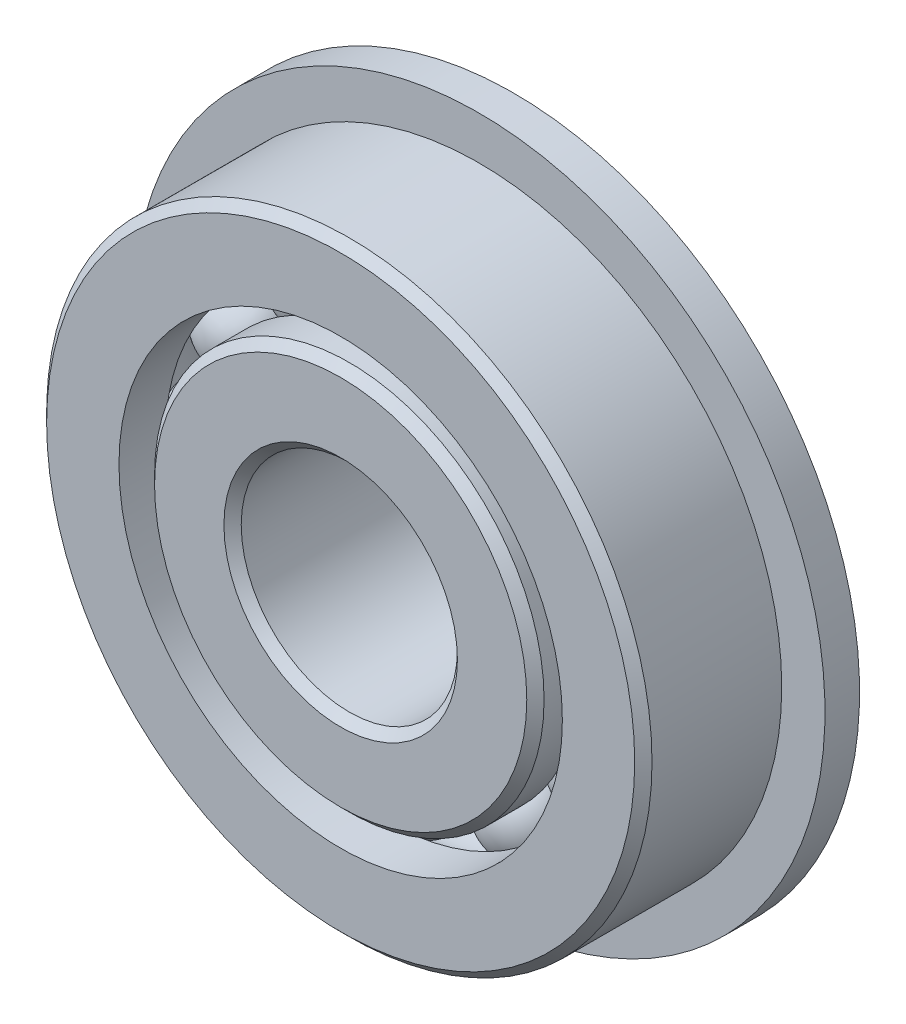
ISO-10303-21;
HEADER;
FILE_DESCRIPTION(('STEP AP214'),'2;1');
FILE_NAME('part.step','',(''),(''),'','','');
FILE_SCHEMA(('AUTOMOTIVE_DESIGN { 1 0 10303 214 1 1 1 1 }'));
ENDSEC;
DATA;
#1=APPLICATION_CONTEXT('core data for automotive mechanical design processes');
#2=APPLICATION_PROTOCOL_DEFINITION('international standard','automotive_design',2000,#1);
#3=PRODUCT_CONTEXT('',#1,'mechanical');
#4=PRODUCT('Part','Part','',(#3));
#5=PRODUCT_RELATED_PRODUCT_CATEGORY('part','',(#4));
#6=PRODUCT_DEFINITION_FORMATION('','',#4);
#7=PRODUCT_DEFINITION_CONTEXT('part definition',#1,'design');
#8=PRODUCT_DEFINITION('design','',#6,#7);
#9=PRODUCT_DEFINITION_SHAPE('','',#8);
#10=(LENGTH_UNIT() NAMED_UNIT(*) SI_UNIT(.MILLI.,.METRE.));
#11=(NAMED_UNIT(*) PLANE_ANGLE_UNIT() SI_UNIT($,.RADIAN.));
#12=(NAMED_UNIT(*) SI_UNIT($,.STERADIAN.) SOLID_ANGLE_UNIT());
#13=UNCERTAINTY_MEASURE_WITH_UNIT(LENGTH_MEASURE(1.E-05),#10,'distance_accuracy_value','');
#14=(GEOMETRIC_REPRESENTATION_CONTEXT(3) GLOBAL_UNCERTAINTY_ASSIGNED_CONTEXT((#13)) GLOBAL_UNIT_ASSIGNED_CONTEXT((#10,
#11,#12)) REPRESENTATION_CONTEXT('',''));
#15=CARTESIAN_POINT('',(0.,0.,0.));
#16=DIRECTION('',(0.,0.,1.));
#17=DIRECTION('',(1.,0.,0.));
#18=AXIS2_PLACEMENT_3D('',#15,#16,#17);
#19=CARTESIAN_POINT('',(-3.77031249999992,6.53037281041208,0.));
#20=DIRECTION('',(0.,0.,1.));
#21=DIRECTION('',(-0.499999999999989,0.866025403784445,0.));
#22=AXIS2_PLACEMENT_3D('',#19,#20,#21);
#23=SPHERICAL_SURFACE('',#22,1.5875);
#24=CARTESIAN_POINT('',(-3.77031249999992,6.53037281041208,1.5875));
#25=VERTEX_POINT('',#24);
#26=VERTEX_LOOP('',#25);
#27=FACE_BOUND('',#26,.T.);
#28=ADVANCED_FACE('F37',(#27),#23,.T.);
#29=CLOSED_SHELL('',(#28));
#30=MANIFOLD_SOLID_BREP('B2',#29);
#31=CARTESIAN_POINT('',(-6.53037281041199,3.77031250000008,0.));
#32=DIRECTION('',(0.,0.,1.));
#33=DIRECTION('',(-0.866025403784433,0.50000000000001,0.));
#34=AXIS2_PLACEMENT_3D('',#31,#32,#33);
#35=SPHERICAL_SURFACE('',#34,1.5875);
#36=CARTESIAN_POINT('',(-6.53037281041199,3.77031250000008,1.5875));
#37=VERTEX_POINT('',#36);
#38=VERTEX_LOOP('',#37);
#39=FACE_BOUND('',#38,.T.);
#40=ADVANCED_FACE('F57',(#39),#35,.T.);
#41=CLOSED_SHELL('',(#40));
#42=MANIFOLD_SOLID_BREP('B6',#41);
#43=CARTESIAN_POINT('',(-7.540625,0.,0.));
#44=DIRECTION('',(0.,0.,1.));
#45=DIRECTION('',(-1.,0.,0.));
#46=AXIS2_PLACEMENT_3D('',#43,#44,#45);
#47=SPHERICAL_SURFACE('',#46,1.5875);
#48=CARTESIAN_POINT('',(-7.540625,0.,1.5875));
#49=VERTEX_POINT('',#48);
#50=VERTEX_LOOP('',#49);
#51=FACE_BOUND('',#50,.T.);
#52=ADVANCED_FACE('F77',(#51),#47,.T.);
#53=CLOSED_SHELL('',(#52));
#54=MANIFOLD_SOLID_BREP('B33',#53);
#55=CARTESIAN_POINT('',(-6.53037281041207,-3.77031249999994,0.));
#56=DIRECTION('',(0.,0.,1.));
#57=DIRECTION('',(-0.866025403784443,-0.499999999999992,0.));
#58=AXIS2_PLACEMENT_3D('',#55,#56,#57);
#59=SPHERICAL_SURFACE('',#58,1.5875);
#60=CARTESIAN_POINT('',(-6.53037281041207,-3.77031249999994,1.5875));
#61=VERTEX_POINT('',#60);
#62=VERTEX_LOOP('',#61);
#63=FACE_BOUND('',#62,.T.);
#64=ADVANCED_FACE('F97',(#63),#59,.T.);
#65=CLOSED_SHELL('',(#64));
#66=MANIFOLD_SOLID_BREP('B53',#65);
#67=CARTESIAN_POINT('',(-3.77031250000005,-6.530372810412,0.));
#68=DIRECTION('',(0.,0.,1.));
#69=DIRECTION('',(-0.500000000000007,-0.866025403784435,0.));
#70=AXIS2_PLACEMENT_3D('',#67,#68,#69);
#71=SPHERICAL_SURFACE('',#70,1.5875);
#72=CARTESIAN_POINT('',(-3.77031250000005,-6.530372810412,1.5875));
#73=VERTEX_POINT('',#72);
#74=VERTEX_LOOP('',#73);
#75=FACE_BOUND('',#74,.T.);
#76=ADVANCED_FACE('F117',(#75),#71,.T.);
#77=CLOSED_SHELL('',(#76));
#78=MANIFOLD_SOLID_BREP('B73',#77);
#79=CARTESIAN_POINT('',(0.,-7.540625,0.));
#80=DIRECTION('',(0.,0.,1.));
#81=DIRECTION('',(0.,-1.,0.));
#82=AXIS2_PLACEMENT_3D('',#79,#80,#81);
#83=SPHERICAL_SURFACE('',#82,1.5875);
#84=CARTESIAN_POINT('',(0.,-7.540625,1.5875));
#85=VERTEX_POINT('',#84);
#86=VERTEX_LOOP('',#85);
#87=FACE_BOUND('',#86,.T.);
#88=ADVANCED_FACE('F137',(#87),#83,.T.);
#89=CLOSED_SHELL('',(#88));
#90=MANIFOLD_SOLID_BREP('B93',#89);
#91=CARTESIAN_POINT('',(3.77031249999996,-6.53037281041205,0.));
#92=DIRECTION('',(0.,0.,1.));
#93=DIRECTION('',(0.499999999999995,-0.866025403784442,0.));
#94=AXIS2_PLACEMENT_3D('',#91,#92,#93);
#95=SPHERICAL_SURFACE('',#94,1.5875);
#96=CARTESIAN_POINT('',(3.77031249999996,-6.53037281041205,1.5875));
#97=VERTEX_POINT('',#96);
#98=VERTEX_LOOP('',#97);
#99=FACE_BOUND('',#98,.T.);
#100=ADVANCED_FACE('F157',(#99),#95,.T.);
#101=CLOSED_SHELL('',(#100));
#102=MANIFOLD_SOLID_BREP('B113',#101);
#103=CARTESIAN_POINT('',(6.53037281041202,-3.77031250000003,0.));
#104=DIRECTION('',(0.,0.,1.));
#105=DIRECTION('',(0.866025403784436,-0.500000000000004,0.));
#106=AXIS2_PLACEMENT_3D('',#103,#104,#105);
#107=SPHERICAL_SURFACE('',#106,1.5875);
#108=CARTESIAN_POINT('',(6.53037281041202,-3.77031250000003,1.5875));
#109=VERTEX_POINT('',#108);
#110=VERTEX_LOOP('',#109);
#111=FACE_BOUND('',#110,.T.);
#112=ADVANCED_FACE('F177',(#111),#107,.T.);
#113=CLOSED_SHELL('',(#112));
#114=MANIFOLD_SOLID_BREP('B133',#113);
#115=CARTESIAN_POINT('',(7.540625,0.,0.));
#116=DIRECTION('',(0.,0.,1.));
#117=DIRECTION('',(1.,0.,0.));
#118=AXIS2_PLACEMENT_3D('',#115,#116,#117);
#119=SPHERICAL_SURFACE('',#118,1.5875);
#120=CARTESIAN_POINT('',(7.540625,0.,1.5875));
#121=VERTEX_POINT('',#120);
#122=VERTEX_LOOP('',#121);
#123=FACE_BOUND('',#122,.T.);
#124=ADVANCED_FACE('F197',(#123),#119,.T.);
#125=CLOSED_SHELL('',(#124));
#126=MANIFOLD_SOLID_BREP('B153',#125);
#127=CARTESIAN_POINT('',(6.53037281041204,3.77031249999998,0.));
#128=DIRECTION('',(0.,0.,1.));
#129=DIRECTION('',(0.86602540378444,0.499999999999998,0.));
#130=AXIS2_PLACEMENT_3D('',#127,#128,#129);
#131=SPHERICAL_SURFACE('',#130,1.5875);
#132=CARTESIAN_POINT('',(6.53037281041204,3.77031249999998,1.5875));
#133=VERTEX_POINT('',#132);
#134=VERTEX_LOOP('',#133);
#135=FACE_BOUND('',#134,.T.);
#136=ADVANCED_FACE('F217',(#135),#131,.T.);
#137=CLOSED_SHELL('',(#136));
#138=MANIFOLD_SOLID_BREP('B173',#137);
#139=CARTESIAN_POINT('',(3.77031250000001,6.53037281041203,0.));
#140=DIRECTION('',(0.,0.,1.));
#141=DIRECTION('',(0.500000000000001,0.866025403784438,0.));
#142=AXIS2_PLACEMENT_3D('',#139,#140,#141);
#143=SPHERICAL_SURFACE('',#142,1.5875);
#144=CARTESIAN_POINT('',(3.77031250000001,6.53037281041203,1.5875));
#145=VERTEX_POINT('',#144);
#146=VERTEX_LOOP('',#145);
#147=FACE_BOUND('',#146,.T.);
#148=ADVANCED_FACE('F237',(#147),#143,.T.);
#149=CLOSED_SHELL('',(#148));
#150=MANIFOLD_SOLID_BREP('B193',#149);
#151=CARTESIAN_POINT('',(0.,7.540625,0.));
#152=DIRECTION('',(0.,0.,1.));
#153=DIRECTION('',(0.,1.,0.));
#154=AXIS2_PLACEMENT_3D('',#151,#152,#153);
#155=SPHERICAL_SURFACE('',#154,1.5875);
#156=CARTESIAN_POINT('',(0.,7.540625,1.5875));
#157=VERTEX_POINT('',#156);
#158=VERTEX_LOOP('',#157);
#159=FACE_BOUND('',#158,.T.);
#160=ADVANCED_FACE('F259',(#159),#155,.T.);
#161=CLOSED_SHELL('',(#160));
#162=MANIFOLD_SOLID_BREP('B213',#161);
#163=CARTESIAN_POINT('',(0.,0.,2.8575));
#164=DIRECTION('',(0.,0.,-1.));
#165=DIRECTION('',(-1.,0.,0.));
#166=AXIS2_PLACEMENT_3D('',#163,#164,#165);
#167=CONICAL_SURFACE('',#166,7.1501,0.785398163397444);
#168=CARTESIAN_POINT('',(0.,0.,3.175));
#169=DIRECTION('',(0.,0.,1.));
#170=DIRECTION('',(1.,0.,0.));
#171=AXIS2_PLACEMENT_3D('',#168,#169,#170);
#172=CIRCLE('',#171,6.8326);
#173=CARTESIAN_POINT('',(6.8326,0.,3.175));
#174=VERTEX_POINT('',#173);
#175=EDGE_CURVE('E258',#174,#174,#172,.T.);
#176=ORIENTED_EDGE('',*,*,#175,.F.);
#177=EDGE_LOOP('',(#176));
#178=FACE_BOUND('',#177,.T.);
#179=CARTESIAN_POINT('',(0.,0.,2.8575));
#180=DIRECTION('',(0.,0.,1.));
#181=DIRECTION('',(1.,0.,0.));
#182=AXIS2_PLACEMENT_3D('',#179,#180,#181);
#183=CIRCLE('',#182,7.1501);
#184=CARTESIAN_POINT('',(7.1501,0.,2.8575));
#185=VERTEX_POINT('',#184);
#186=EDGE_CURVE('E312',#185,#185,#183,.T.);
#187=ORIENTED_EDGE('',*,*,#186,.T.);
#188=EDGE_LOOP('',(#187));
#189=FACE_BOUND('',#188,.T.);
#190=ADVANCED_FACE('F278',(#178,#189),#167,.T.);
#191=CARTESIAN_POINT('',(0.,4.28625,3.175));
#192=DIRECTION('',(0.,0.,-1.));
#193=DIRECTION('',(-1.,0.,0.));
#194=AXIS2_PLACEMENT_3D('',#191,#192,#193);
#195=PLANE('',#194);
#196=CARTESIAN_POINT('',(0.,0.,3.175));
#197=DIRECTION('',(0.,0.,1.));
#198=DIRECTION('',(1.,0.,0.));
#199=AXIS2_PLACEMENT_3D('',#196,#197,#198);
#200=CIRCLE('',#199,4.28625);
#201=CARTESIAN_POINT('',(4.28625,0.,3.175));
#202=VERTEX_POINT('',#201);
#203=EDGE_CURVE('E284',#202,#202,#200,.T.);
#204=ORIENTED_EDGE('',*,*,#203,.F.);
#205=EDGE_LOOP('',(#204));
#206=FACE_BOUND('',#205,.T.);
#207=ORIENTED_EDGE('',*,*,#175,.T.);
#208=EDGE_LOOP('',(#207));
#209=FACE_BOUND('',#208,.T.);
#210=ADVANCED_FACE('F361',(#206,#209),#195,.F.);
#211=CARTESIAN_POINT('',(0.,0.,3.175));
#212=DIRECTION('',(0.,0.,1.));
#213=DIRECTION('',(1.,0.,0.));
#214=AXIS2_PLACEMENT_3D('',#211,#212,#213);
#215=CONICAL_SURFACE('',#214,4.28625,0.785398163397448);
#216=CARTESIAN_POINT('',(0.,0.,2.8575));
#217=DIRECTION('',(0.,0.,1.));
#218=DIRECTION('',(1.,0.,0.));
#219=AXIS2_PLACEMENT_3D('',#216,#217,#218);
#220=CIRCLE('',#219,3.96875);
#221=CARTESIAN_POINT('',(3.96875,0.,2.8575));
#222=VERTEX_POINT('',#221);
#223=EDGE_CURVE('E288',#222,#222,#220,.T.);
#224=ORIENTED_EDGE('',*,*,#223,.F.);
#225=EDGE_LOOP('',(#224));
#226=FACE_BOUND('',#225,.T.);
#227=ORIENTED_EDGE('',*,*,#203,.T.);
#228=EDGE_LOOP('',(#227));
#229=FACE_BOUND('',#228,.T.);
#230=ADVANCED_FACE('F356',(#226,#229),#215,.F.);
#231=CARTESIAN_POINT('',(0.,0.,3.175));
#232=DIRECTION('',(0.,0.,1.));
#233=DIRECTION('',(1.,0.,0.));
#234=AXIS2_PLACEMENT_3D('',#231,#232,#233);
#235=CYLINDRICAL_SURFACE('',#234,3.96875);
#236=CARTESIAN_POINT('',(0.,0.,-4.4577));
#237=DIRECTION('',(0.,0.,1.));
#238=DIRECTION('',(1.,0.,0.));
#239=AXIS2_PLACEMENT_3D('',#236,#237,#238);
#240=CIRCLE('',#239,3.96875);
#241=CARTESIAN_POINT('',(3.96875,0.,-4.4577));
#242=VERTEX_POINT('',#241);
#243=EDGE_CURVE('E292',#242,#242,#240,.T.);
#244=ORIENTED_EDGE('',*,*,#243,.F.);
#245=EDGE_LOOP('',(#244));
#246=FACE_BOUND('',#245,.T.);
#247=ORIENTED_EDGE('',*,*,#223,.T.);
#248=EDGE_LOOP('',(#247));
#249=FACE_BOUND('',#248,.T.);
#250=ADVANCED_FACE('F350',(#246,#249),#235,.F.);
#251=CARTESIAN_POINT('',(0.,0.,-4.4577));
#252=DIRECTION('',(0.,0.,-1.));
#253=DIRECTION('',(-1.,0.,0.));
#254=AXIS2_PLACEMENT_3D('',#251,#252,#253);
#255=CONICAL_SURFACE('',#254,3.96875,0.785398163397446);
#256=CARTESIAN_POINT('',(0.,0.,-4.7752));
#257=DIRECTION('',(0.,0.,1.));
#258=DIRECTION('',(1.,0.,0.));
#259=AXIS2_PLACEMENT_3D('',#256,#257,#258);
#260=CIRCLE('',#259,4.28625);
#261=CARTESIAN_POINT('',(4.28625,0.,-4.7752));
#262=VERTEX_POINT('',#261);
#263=EDGE_CURVE('E297',#262,#262,#260,.T.);
#264=ORIENTED_EDGE('',*,*,#263,.F.);
#265=EDGE_LOOP('',(#264));
#266=FACE_BOUND('',#265,.T.);
#267=ORIENTED_EDGE('',*,*,#243,.T.);
#268=EDGE_LOOP('',(#267));
#269=FACE_BOUND('',#268,.T.);
#270=ADVANCED_FACE('F344',(#266,#269),#255,.F.);
#271=CARTESIAN_POINT('',(0.,6.8326,-4.7752));
#272=DIRECTION('',(0.,0.,1.));
#273=DIRECTION('',(1.,0.,0.));
#274=AXIS2_PLACEMENT_3D('',#271,#272,#273);
#275=PLANE('',#274);
#276=CARTESIAN_POINT('',(0.,0.,-4.7752));
#277=DIRECTION('',(0.,0.,1.));
#278=DIRECTION('',(1.,0.,0.));
#279=AXIS2_PLACEMENT_3D('',#276,#277,#278);
#280=CIRCLE('',#279,6.8326);
#281=CARTESIAN_POINT('',(6.8326,0.,-4.7752));
#282=VERTEX_POINT('',#281);
#283=EDGE_CURVE('E300',#282,#282,#280,.T.);
#284=ORIENTED_EDGE('',*,*,#283,.F.);
#285=EDGE_LOOP('',(#284));
#286=FACE_BOUND('',#285,.T.);
#287=ORIENTED_EDGE('',*,*,#263,.T.);
#288=EDGE_LOOP('',(#287));
#289=FACE_BOUND('',#288,.T.);
#290=ADVANCED_FACE('F338',(#286,#289),#275,.F.);
#291=CARTESIAN_POINT('',(0.,0.,-4.7752));
#292=DIRECTION('',(0.,0.,1.));
#293=DIRECTION('',(1.,0.,0.));
#294=AXIS2_PLACEMENT_3D('',#291,#292,#293);
#295=CONICAL_SURFACE('',#294,6.8326,0.785398163397448);
#296=CARTESIAN_POINT('',(0.,0.,-4.4577));
#297=DIRECTION('',(0.,0.,1.));
#298=DIRECTION('',(1.,0.,0.));
#299=AXIS2_PLACEMENT_3D('',#296,#297,#298);
#300=CIRCLE('',#299,7.1501);
#301=CARTESIAN_POINT('',(7.1501,0.,-4.4577));
#302=VERTEX_POINT('',#301);
#303=EDGE_CURVE('E303',#302,#302,#300,.T.);
#304=ORIENTED_EDGE('',*,*,#303,.F.);
#305=EDGE_LOOP('',(#304));
#306=FACE_BOUND('',#305,.T.);
#307=ORIENTED_EDGE('',*,*,#283,.T.);
#308=EDGE_LOOP('',(#307));
#309=FACE_BOUND('',#308,.T.);
#310=ADVANCED_FACE('F332',(#306,#309),#295,.T.);
#311=CARTESIAN_POINT('',(0.,0.,3.175));
#312=DIRECTION('',(0.,0.,1.));
#313=DIRECTION('',(1.,0.,0.));
#314=AXIS2_PLACEMENT_3D('',#311,#312,#313);
#315=CYLINDRICAL_SURFACE('',#314,7.1501);
#316=CARTESIAN_POINT('',(0.,0.,-1.53871585238309));
#317=DIRECTION('',(0.,0.,1.));
#318=DIRECTION('',(1.,0.,0.));
#319=AXIS2_PLACEMENT_3D('',#316,#317,#318);
#320=CIRCLE('',#319,7.1501);
#321=CARTESIAN_POINT('',(7.1501,0.,-1.53871585238309));
#322=VERTEX_POINT('',#321);
#323=EDGE_CURVE('E306',#322,#322,#320,.T.);
#324=ORIENTED_EDGE('',*,*,#323,.F.);
#325=EDGE_LOOP('',(#324));
#326=FACE_BOUND('',#325,.T.);
#327=ORIENTED_EDGE('',*,*,#303,.T.);
#328=EDGE_LOOP('',(#327));
#329=FACE_BOUND('',#328,.T.);
#330=ADVANCED_FACE('F326',(#326,#329),#315,.T.);
#331=CARTESIAN_POINT('',(0.,0.,0.));
#332=DIRECTION('',(0.,0.,1.));
#333=DIRECTION('',(1.,0.,0.));
#334=AXIS2_PLACEMENT_3D('',#331,#332,#333);
#335=TOROIDAL_SURFACE('',#334,7.540625,1.5875);
#336=CARTESIAN_POINT('',(0.,0.,1.53871585238309));
#337=DIRECTION('',(0.,0.,1.));
#338=DIRECTION('',(1.,0.,0.));
#339=AXIS2_PLACEMENT_3D('',#336,#337,#338);
#340=CIRCLE('',#339,7.1501);
#341=CARTESIAN_POINT('',(7.1501,0.,1.53871585238309));
#342=VERTEX_POINT('',#341);
#343=EDGE_CURVE('E309',#342,#342,#340,.T.);
#344=ORIENTED_EDGE('',*,*,#343,.F.);
#345=EDGE_LOOP('',(#344));
#346=FACE_BOUND('',#345,.T.);
#347=ORIENTED_EDGE('',*,*,#323,.T.);
#348=EDGE_LOOP('',(#347));
#349=FACE_BOUND('',#348,.T.);
#350=ADVANCED_FACE('F320',(#346,#349),#335,.F.);
#351=CARTESIAN_POINT('',(0.,0.,3.175));
#352=DIRECTION('',(0.,0.,1.));
#353=DIRECTION('',(1.,0.,0.));
#354=AXIS2_PLACEMENT_3D('',#351,#352,#353);
#355=CYLINDRICAL_SURFACE('',#354,7.1501);
#356=ORIENTED_EDGE('',*,*,#186,.F.);
#357=EDGE_LOOP('',(#356));
#358=FACE_BOUND('',#357,.T.);
#359=ORIENTED_EDGE('',*,*,#343,.T.);
#360=EDGE_LOOP('',(#359));
#361=FACE_BOUND('',#360,.T.);
#362=ADVANCED_FACE('F317',(#358,#361),#355,.T.);
#363=CLOSED_SHELL('',(#190,#210,#230,#250,#270,#290,#310,#330,#350,#362));
#364=MANIFOLD_SOLID_BREP('B233',#363);
#365=CARTESIAN_POINT('',(0.,0.,2.8575));
#366=DIRECTION('',(0.,0.,-1.));
#367=DIRECTION('',(-1.,0.,0.));
#368=AXIS2_PLACEMENT_3D('',#365,#366,#367);
#369=CONICAL_SURFACE('',#368,11.1125,0.785398163397446);
#370=CARTESIAN_POINT('',(0.,0.,3.175));
#371=DIRECTION('',(0.,0.,1.));
#372=DIRECTION('',(1.,0.,0.));
#373=AXIS2_PLACEMENT_3D('',#370,#371,#372);
#374=CIRCLE('',#373,10.795);
#375=CARTESIAN_POINT('',(10.795,0.,3.175));
#376=VERTEX_POINT('',#375);
#377=EDGE_CURVE('E451',#376,#376,#374,.T.);
#378=ORIENTED_EDGE('',*,*,#377,.F.);
#379=EDGE_LOOP('',(#378));
#380=FACE_BOUND('',#379,.T.);
#381=CARTESIAN_POINT('',(0.,0.,2.8575));
#382=DIRECTION('',(0.,0.,1.));
#383=DIRECTION('',(1.,0.,0.));
#384=AXIS2_PLACEMENT_3D('',#381,#382,#383);
#385=CIRCLE('',#384,11.1125);
#386=CARTESIAN_POINT('',(11.1125,0.,2.8575));
#387=VERTEX_POINT('',#386);
#388=EDGE_CURVE('E277',#387,#387,#385,.T.);
#389=ORIENTED_EDGE('',*,*,#388,.T.);
#390=EDGE_LOOP('',(#389));
#391=FACE_BOUND('',#390,.T.);
#392=ADVANCED_FACE('F429',(#380,#391),#369,.T.);
#393=CARTESIAN_POINT('',(0.,0.,3.175));
#394=DIRECTION('',(0.,0.,1.));
#395=DIRECTION('',(1.,0.,0.));
#396=AXIS2_PLACEMENT_3D('',#393,#394,#395);
#397=CYLINDRICAL_SURFACE('',#396,11.1125);
#398=CARTESIAN_POINT('',(0.,0.,-1.905));
#399=DIRECTION('',(0.,0.,1.));
#400=DIRECTION('',(1.,0.,0.));
#401=AXIS2_PLACEMENT_3D('',#398,#399,#400);
#402=CIRCLE('',#401,11.1125);
#403=CARTESIAN_POINT('',(11.1125,0.,-1.905));
#404=VERTEX_POINT('',#403);
#405=EDGE_CURVE('E454',#404,#404,#402,.T.);
#406=ORIENTED_EDGE('',*,*,#405,.T.);
#407=EDGE_LOOP('',(#406));
#408=FACE_BOUND('',#407,.T.);
#409=ORIENTED_EDGE('',*,*,#388,.F.);
#410=EDGE_LOOP('',(#409));
#411=FACE_BOUND('',#410,.T.);
#412=ADVANCED_FACE('F474',(#408,#411),#397,.T.);
#413=CARTESIAN_POINT('',(0.,10.795,-3.175));
#414=DIRECTION('',(0.,0.,1.));
#415=DIRECTION('',(1.,0.,0.));
#416=AXIS2_PLACEMENT_3D('',#413,#414,#415);
#417=PLANE('',#416);
#418=CARTESIAN_POINT('',(0.,0.,-3.175));
#419=DIRECTION('',(0.,0.,1.));
#420=DIRECTION('',(1.,0.,0.));
#421=AXIS2_PLACEMENT_3D('',#418,#419,#420);
#422=CIRCLE('',#421,8.1391125);
#423=CARTESIAN_POINT('',(8.1391125,0.,-3.175));
#424=VERTEX_POINT('',#423);
#425=EDGE_CURVE('E435',#424,#424,#422,.T.);
#426=ORIENTED_EDGE('',*,*,#425,.T.);
#427=EDGE_LOOP('',(#426));
#428=FACE_BOUND('',#427,.T.);
#429=CARTESIAN_POINT('',(0.,0.,-3.175));
#430=DIRECTION('',(0.,0.,-1.));
#431=DIRECTION('',(-1.,0.,0.));
#432=AXIS2_PLACEMENT_3D('',#429,#430,#431);
#433=CIRCLE('',#432,12.7);
#434=CARTESIAN_POINT('',(-12.7,0.,-3.175));
#435=VERTEX_POINT('',#434);
#436=EDGE_CURVE('E457',#435,#435,#433,.T.);
#437=ORIENTED_EDGE('',*,*,#436,.T.);
#438=EDGE_LOOP('',(#437));
#439=FACE_BOUND('',#438,.T.);
#440=ADVANCED_FACE('F477',(#428,#439),#417,.F.);
#441=CARTESIAN_POINT('',(0.,0.,3.175));
#442=DIRECTION('',(0.,0.,1.));
#443=DIRECTION('',(1.,0.,0.));
#444=AXIS2_PLACEMENT_3D('',#441,#442,#443);
#445=CYLINDRICAL_SURFACE('',#444,8.1391125);
#446=CARTESIAN_POINT('',(0.,0.,-1.4703635476792));
#447=DIRECTION('',(0.,0.,1.));
#448=DIRECTION('',(1.,0.,0.));
#449=AXIS2_PLACEMENT_3D('',#446,#447,#448);
#450=CIRCLE('',#449,8.1391125);
#451=CARTESIAN_POINT('',(8.1391125,0.,-1.4703635476792));
#452=VERTEX_POINT('',#451);
#453=EDGE_CURVE('E439',#452,#452,#450,.T.);
#454=ORIENTED_EDGE('',*,*,#453,.T.);
#455=EDGE_LOOP('',(#454));
#456=FACE_BOUND('',#455,.T.);
#457=ORIENTED_EDGE('',*,*,#425,.F.);
#458=EDGE_LOOP('',(#457));
#459=FACE_BOUND('',#458,.T.);
#460=ADVANCED_FACE('F482',(#456,#459),#445,.F.);
#461=CARTESIAN_POINT('',(0.,0.,0.));
#462=DIRECTION('',(0.,0.,1.));
#463=DIRECTION('',(1.,0.,0.));
#464=AXIS2_PLACEMENT_3D('',#461,#462,#463);
#465=TOROIDAL_SURFACE('',#464,7.540625,1.5875);
#466=ORIENTED_EDGE('',*,*,#453,.F.);
#467=EDGE_LOOP('',(#466));
#468=FACE_BOUND('',#467,.T.);
#469=CARTESIAN_POINT('',(0.,0.,1.4703635476792));
#470=DIRECTION('',(0.,0.,1.));
#471=DIRECTION('',(1.,0.,0.));
#472=AXIS2_PLACEMENT_3D('',#469,#470,#471);
#473=CIRCLE('',#472,8.1391125);
#474=CARTESIAN_POINT('',(8.1391125,0.,1.4703635476792));
#475=VERTEX_POINT('',#474);
#476=EDGE_CURVE('E443',#475,#475,#473,.T.);
#477=ORIENTED_EDGE('',*,*,#476,.T.);
#478=EDGE_LOOP('',(#477));
#479=FACE_BOUND('',#478,.T.);
#480=ADVANCED_FACE('F488',(#468,#479),#465,.F.);
#481=CARTESIAN_POINT('',(0.,0.,3.175));
#482=DIRECTION('',(0.,0.,1.));
#483=DIRECTION('',(1.,0.,0.));
#484=AXIS2_PLACEMENT_3D('',#481,#482,#483);
#485=CYLINDRICAL_SURFACE('',#484,8.1391125);
#486=ORIENTED_EDGE('',*,*,#476,.F.);
#487=EDGE_LOOP('',(#486));
#488=FACE_BOUND('',#487,.T.);
#489=CARTESIAN_POINT('',(0.,0.,3.175));
#490=DIRECTION('',(0.,0.,1.));
#491=DIRECTION('',(1.,0.,0.));
#492=AXIS2_PLACEMENT_3D('',#489,#490,#491);
#493=CIRCLE('',#492,8.1391125);
#494=CARTESIAN_POINT('',(8.1391125,0.,3.175));
#495=VERTEX_POINT('',#494);
#496=EDGE_CURVE('E448',#495,#495,#493,.T.);
#497=ORIENTED_EDGE('',*,*,#496,.T.);
#498=EDGE_LOOP('',(#497));
#499=FACE_BOUND('',#498,.T.);
#500=ADVANCED_FACE('F492',(#488,#499),#485,.F.);
#501=CARTESIAN_POINT('',(0.,10.795,3.175));
#502=DIRECTION('',(0.,0.,-1.));
#503=DIRECTION('',(-1.,0.,0.));
#504=AXIS2_PLACEMENT_3D('',#501,#502,#503);
#505=PLANE('',#504);
#506=ORIENTED_EDGE('',*,*,#496,.F.);
#507=EDGE_LOOP('',(#506));
#508=FACE_BOUND('',#507,.T.);
#509=ORIENTED_EDGE('',*,*,#377,.T.);
#510=EDGE_LOOP('',(#509));
#511=FACE_BOUND('',#510,.T.);
#512=ADVANCED_FACE('F470',(#508,#511),#505,.F.);
#513=CARTESIAN_POINT('',(0.,8.1391125,-1.905));
#514=DIRECTION('',(0.,0.,1.));
#515=DIRECTION('',(1.,0.,0.));
#516=AXIS2_PLACEMENT_3D('',#513,#514,#515);
#517=PLANE('',#516);
#518=CARTESIAN_POINT('',(0.,0.,-1.905));
#519=DIRECTION('',(0.,0.,-1.));
#520=DIRECTION('',(-1.,0.,0.));
#521=AXIS2_PLACEMENT_3D('',#518,#519,#520);
#522=CIRCLE('',#521,12.7);
#523=CARTESIAN_POINT('',(-12.7,0.,-1.905));
#524=VERTEX_POINT('',#523);
#525=EDGE_CURVE('E460',#524,#524,#522,.T.);
#526=ORIENTED_EDGE('',*,*,#525,.F.);
#527=EDGE_LOOP('',(#526));
#528=FACE_BOUND('',#527,.T.);
#529=ORIENTED_EDGE('',*,*,#405,.F.);
#530=EDGE_LOOP('',(#529));
#531=FACE_BOUND('',#530,.T.);
#532=ADVANCED_FACE('F467',(#528,#531),#517,.T.);
#533=CARTESIAN_POINT('',(0.,0.,-3.175));
#534=DIRECTION('',(0.,0.,-1.));
#535=DIRECTION('',(-1.,0.,0.));
#536=AXIS2_PLACEMENT_3D('',#533,#534,#535);
#537=CYLINDRICAL_SURFACE('',#536,12.7);
#538=ORIENTED_EDGE('',*,*,#525,.T.);
#539=EDGE_LOOP('',(#538));
#540=FACE_BOUND('',#539,.T.);
#541=ORIENTED_EDGE('',*,*,#436,.F.);
#542=EDGE_LOOP('',(#541));
#543=FACE_BOUND('',#542,.T.);
#544=ADVANCED_FACE('F464',(#540,#543),#537,.T.);
#545=CLOSED_SHELL('',(#392,#412,#440,#460,#480,#500,#512,#532,#544));
#546=MANIFOLD_SOLID_BREP('B253',#545);
#547=ADVANCED_BREP_SHAPE_REPRESENTATION('',(#18,#30,#42,#54,#66,#78,#90,#102,#114,#126,#138,
#150,#162,#364,#546),#14);
#548=SHAPE_DEFINITION_REPRESENTATION(#9,#547);
ENDSEC;
END-ISO-10303-21;
